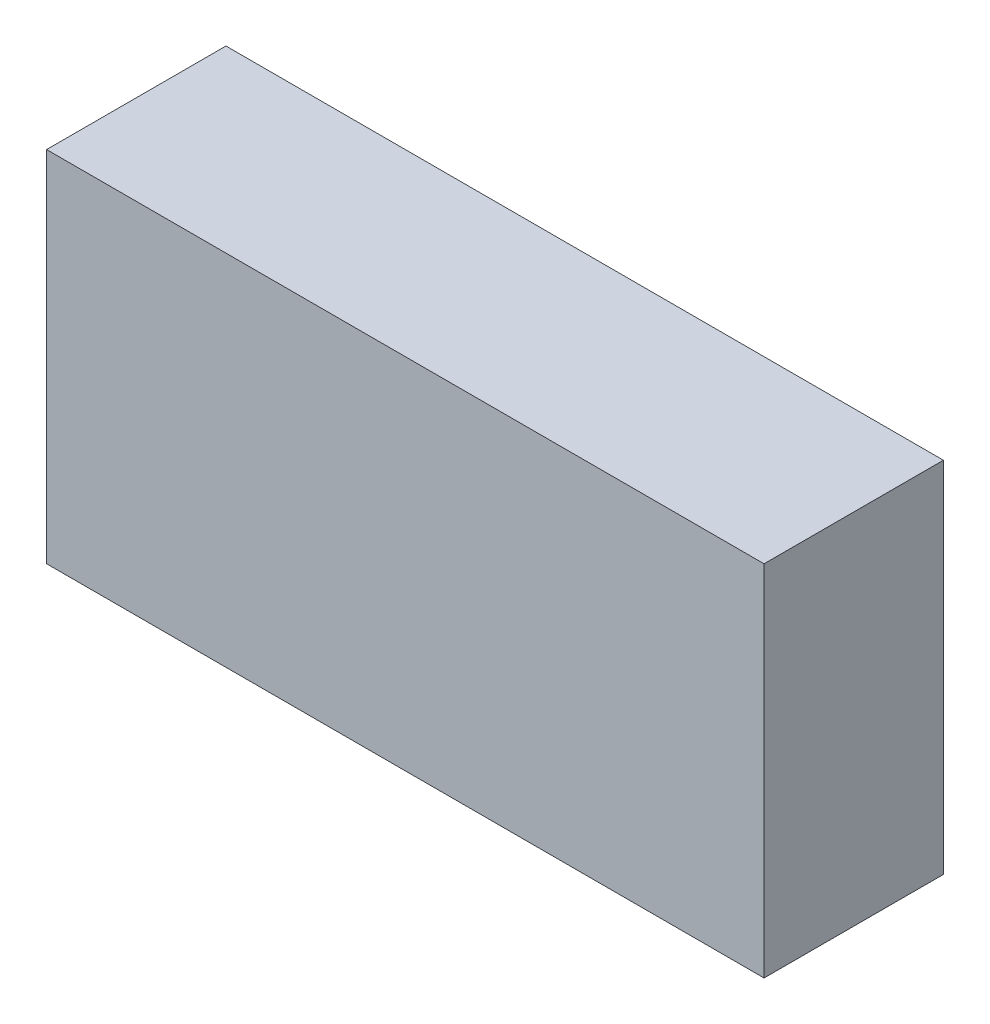
ISO-10303-21;
HEADER;
FILE_DESCRIPTION(('STEP AP214'),'2;1');
FILE_NAME('part.step','',(''),(''),'','','');
FILE_SCHEMA(('AUTOMOTIVE_DESIGN { 1 0 10303 214 1 1 1 1 }'));
ENDSEC;
DATA;
#1=APPLICATION_CONTEXT('core data for automotive mechanical design processes');
#2=APPLICATION_PROTOCOL_DEFINITION('international standard','automotive_design',2000,#1);
#3=PRODUCT_CONTEXT('',#1,'mechanical');
#4=PRODUCT('Part','Part','',(#3));
#5=PRODUCT_RELATED_PRODUCT_CATEGORY('part','',(#4));
#6=PRODUCT_DEFINITION_FORMATION('','',#4);
#7=PRODUCT_DEFINITION_CONTEXT('part definition',#1,'design');
#8=PRODUCT_DEFINITION('design','',#6,#7);
#9=PRODUCT_DEFINITION_SHAPE('','',#8);
#10=(LENGTH_UNIT() NAMED_UNIT(*) SI_UNIT(.MILLI.,.METRE.));
#11=(NAMED_UNIT(*) PLANE_ANGLE_UNIT() SI_UNIT($,.RADIAN.));
#12=(NAMED_UNIT(*) SI_UNIT($,.STERADIAN.) SOLID_ANGLE_UNIT());
#13=UNCERTAINTY_MEASURE_WITH_UNIT(LENGTH_MEASURE(1.E-05),#10,'distance_accuracy_value','');
#14=(GEOMETRIC_REPRESENTATION_CONTEXT(3) GLOBAL_UNCERTAINTY_ASSIGNED_CONTEXT((#13)) GLOBAL_UNIT_ASSIGNED_CONTEXT((#10,
#11,#12)) REPRESENTATION_CONTEXT('',''));
#15=CARTESIAN_POINT('',(0.,0.,0.));
#16=DIRECTION('',(0.,0.,1.));
#17=DIRECTION('',(1.,0.,0.));
#18=AXIS2_PLACEMENT_3D('',#15,#16,#17);
#19=CARTESIAN_POINT('',(-50.,50.,12.5));
#20=DIRECTION('',(1.,0.,0.));
#21=DIRECTION('',(0.,0.,-1.));
#22=AXIS2_PLACEMENT_3D('',#19,#20,#21);
#23=PLANE('',#22);
#24=DIRECTION('',(0.,0.,1.));
#25=VECTOR('',#24,1.);
#26=CARTESIAN_POINT('',(-50.,0.,12.5));
#27=LINE('',#26,#25);
#28=CARTESIAN_POINT('',(-50.,0.,-12.5));
#29=VERTEX_POINT('',#28);
#30=CARTESIAN_POINT('',(-50.,0.,12.5));
#31=VERTEX_POINT('',#30);
#32=EDGE_CURVE('E113',#29,#31,#27,.T.);
#33=ORIENTED_EDGE('',*,*,#32,.T.);
#34=DIRECTION('',(0.,-1.,0.));
#35=VECTOR('',#34,1.);
#36=CARTESIAN_POINT('',(-50.,50.,12.5));
#37=LINE('',#36,#35);
#38=CARTESIAN_POINT('',(-50.,50.,12.5));
#39=VERTEX_POINT('',#38);
#40=EDGE_CURVE('E11',#39,#31,#37,.T.);
#41=ORIENTED_EDGE('',*,*,#40,.F.);
#42=DIRECTION('',(0.,0.,1.));
#43=VECTOR('',#42,1.);
#44=CARTESIAN_POINT('',(-50.,50.,12.5));
#45=LINE('',#44,#43);
#46=CARTESIAN_POINT('',(-50.,50.,-12.5));
#47=VERTEX_POINT('',#46);
#48=EDGE_CURVE('E97',#47,#39,#45,.T.);
#49=ORIENTED_EDGE('',*,*,#48,.F.);
#50=DIRECTION('',(0.,-1.,0.));
#51=VECTOR('',#50,1.);
#52=CARTESIAN_POINT('',(-50.,50.,-12.5));
#53=LINE('',#52,#51);
#54=EDGE_CURVE('E109',#47,#29,#53,.T.);
#55=ORIENTED_EDGE('',*,*,#54,.T.);
#56=EDGE_LOOP('',(#33,#41,#49,#55));
#57=FACE_BOUND('',#56,.T.);
#58=ADVANCED_FACE('F45',(#57),#23,.F.);
#59=CARTESIAN_POINT('',(50.,50.,12.5));
#60=DIRECTION('',(0.,0.,-1.));
#61=DIRECTION('',(-1.,0.,0.));
#62=AXIS2_PLACEMENT_3D('',#59,#60,#61);
#63=PLANE('',#62);
#64=DIRECTION('',(1.,0.,0.));
#65=VECTOR('',#64,1.);
#66=CARTESIAN_POINT('',(50.,0.,12.5));
#67=LINE('',#66,#65);
#68=CARTESIAN_POINT('',(50.,0.,12.5));
#69=VERTEX_POINT('',#68);
#70=EDGE_CURVE('E102',#31,#69,#67,.T.);
#71=ORIENTED_EDGE('',*,*,#70,.T.);
#72=DIRECTION('',(0.,-1.,0.));
#73=VECTOR('',#72,1.);
#74=CARTESIAN_POINT('',(50.,50.,12.5));
#75=LINE('',#74,#73);
#76=CARTESIAN_POINT('',(50.,50.,12.5));
#77=VERTEX_POINT('',#76);
#78=EDGE_CURVE('E54',#77,#69,#75,.T.);
#79=ORIENTED_EDGE('',*,*,#78,.F.);
#80=DIRECTION('',(1.,0.,0.));
#81=VECTOR('',#80,1.);
#82=CARTESIAN_POINT('',(50.,50.,12.5));
#83=LINE('',#82,#81);
#84=EDGE_CURVE('E92',#39,#77,#83,.T.);
#85=ORIENTED_EDGE('',*,*,#84,.F.);
#86=ORIENTED_EDGE('',*,*,#40,.T.);
#87=EDGE_LOOP('',(#71,#79,#85,#86));
#88=FACE_BOUND('',#87,.T.);
#89=ADVANCED_FACE('F101',(#88),#63,.F.);
#90=CARTESIAN_POINT('',(50.,50.,12.5));
#91=DIRECTION('',(-1.,0.,0.));
#92=DIRECTION('',(0.,0.,1.));
#93=AXIS2_PLACEMENT_3D('',#90,#91,#92);
#94=PLANE('',#93);
#95=DIRECTION('',(0.,0.,-1.));
#96=VECTOR('',#95,1.);
#97=CARTESIAN_POINT('',(50.,0.,12.5));
#98=LINE('',#97,#96);
#99=CARTESIAN_POINT('',(50.,0.,-12.5));
#100=VERTEX_POINT('',#99);
#101=EDGE_CURVE('E79',#69,#100,#98,.T.);
#102=ORIENTED_EDGE('',*,*,#101,.T.);
#103=DIRECTION('',(0.,-1.,0.));
#104=VECTOR('',#103,1.);
#105=CARTESIAN_POINT('',(50.,50.,-12.5));
#106=LINE('',#105,#104);
#107=CARTESIAN_POINT('',(50.,50.,-12.5));
#108=VERTEX_POINT('',#107);
#109=EDGE_CURVE('E104',#108,#100,#106,.T.);
#110=ORIENTED_EDGE('',*,*,#109,.F.);
#111=DIRECTION('',(0.,0.,-1.));
#112=VECTOR('',#111,1.);
#113=CARTESIAN_POINT('',(50.,50.,12.5));
#114=LINE('',#113,#112);
#115=EDGE_CURVE('E95',#77,#108,#114,.T.);
#116=ORIENTED_EDGE('',*,*,#115,.F.);
#117=ORIENTED_EDGE('',*,*,#78,.T.);
#118=EDGE_LOOP('',(#102,#110,#116,#117));
#119=FACE_BOUND('',#118,.T.);
#120=ADVANCED_FACE('F105',(#119),#94,.F.);
#121=CARTESIAN_POINT('',(50.,50.,-12.5));
#122=DIRECTION('',(0.,0.,1.));
#123=DIRECTION('',(1.,0.,0.));
#124=AXIS2_PLACEMENT_3D('',#121,#122,#123);
#125=PLANE('',#124);
#126=DIRECTION('',(-1.,0.,0.));
#127=VECTOR('',#126,1.);
#128=CARTESIAN_POINT('',(50.,0.,-12.5));
#129=LINE('',#128,#127);
#130=EDGE_CURVE('E85',#100,#29,#129,.T.);
#131=ORIENTED_EDGE('',*,*,#130,.T.);
#132=ORIENTED_EDGE('',*,*,#54,.F.);
#133=DIRECTION('',(-1.,0.,0.));
#134=VECTOR('',#133,1.);
#135=CARTESIAN_POINT('',(50.,50.,-12.5));
#136=LINE('',#135,#134);
#137=EDGE_CURVE('E62',#108,#47,#136,.T.);
#138=ORIENTED_EDGE('',*,*,#137,.F.);
#139=ORIENTED_EDGE('',*,*,#109,.T.);
#140=EDGE_LOOP('',(#131,#132,#138,#139));
#141=FACE_BOUND('',#140,.T.);
#142=ADVANCED_FACE('F126',(#141),#125,.F.);
#143=CARTESIAN_POINT('',(0.,50.,0.));
#144=DIRECTION('',(0.,1.,0.));
#145=DIRECTION('',(0.,0.,1.));
#146=AXIS2_PLACEMENT_3D('',#143,#144,#145);
#147=PLANE('',#146);
#148=ORIENTED_EDGE('',*,*,#48,.T.);
#149=ORIENTED_EDGE('',*,*,#84,.T.);
#150=ORIENTED_EDGE('',*,*,#115,.T.);
#151=ORIENTED_EDGE('',*,*,#137,.T.);
#152=EDGE_LOOP('',(#148,#149,#150,#151));
#153=FACE_BOUND('',#152,.T.);
#154=ADVANCED_FACE('F93',(#153),#147,.T.);
#155=CARTESIAN_POINT('',(0.,0.,0.));
#156=DIRECTION('',(0.,1.,0.));
#157=DIRECTION('',(0.,0.,1.));
#158=AXIS2_PLACEMENT_3D('',#155,#156,#157);
#159=PLANE('',#158);
#160=ORIENTED_EDGE('',*,*,#32,.F.);
#161=ORIENTED_EDGE('',*,*,#130,.F.);
#162=ORIENTED_EDGE('',*,*,#101,.F.);
#163=ORIENTED_EDGE('',*,*,#70,.F.);
#164=EDGE_LOOP('',(#160,#161,#162,#163));
#165=FACE_BOUND('',#164,.T.);
#166=ADVANCED_FACE('F129',(#165),#159,.F.);
#167=CLOSED_SHELL('',(#58,#89,#120,#142,#154,#166));
#168=MANIFOLD_SOLID_BREP('B2',#167);
#169=ADVANCED_BREP_SHAPE_REPRESENTATION('',(#18,#168),#14);
#170=SHAPE_DEFINITION_REPRESENTATION(#9,#169);
ENDSEC;
END-ISO-10303-21;
